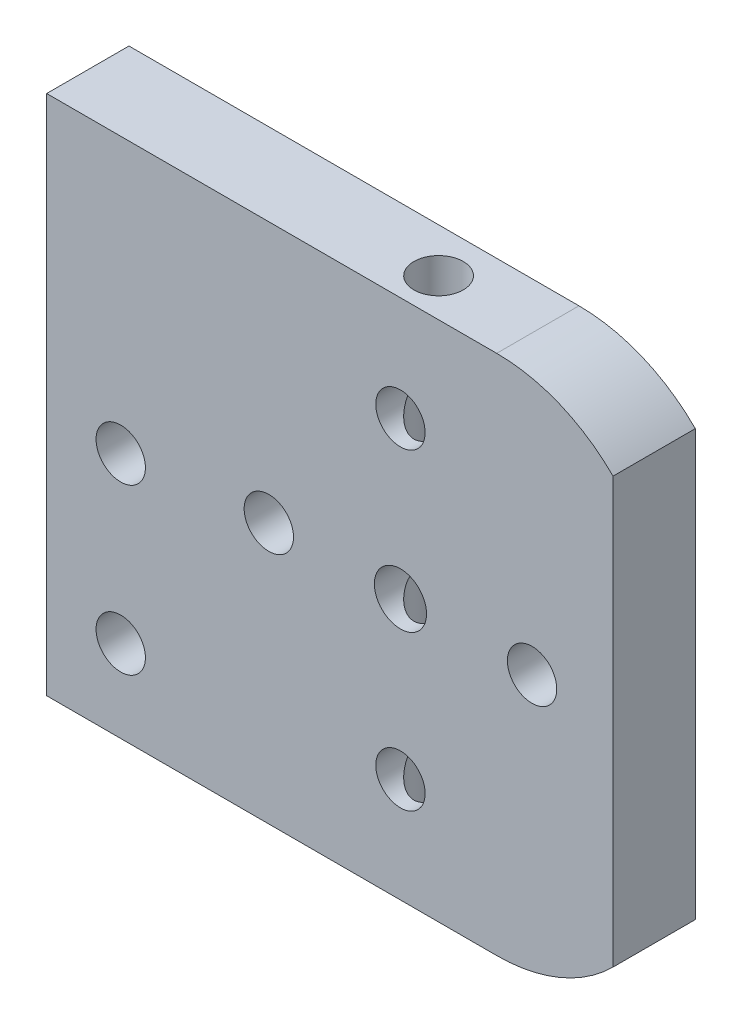
ISO-10303-21;
HEADER;
FILE_DESCRIPTION(('STEP AP214'),'2;1');
FILE_NAME('part.step','',(''),(''),'','','');
FILE_SCHEMA(('AUTOMOTIVE_DESIGN { 1 0 10303 214 1 1 1 1 }'));
ENDSEC;
DATA;
#1=APPLICATION_CONTEXT('core data for automotive mechanical design processes');
#2=APPLICATION_PROTOCOL_DEFINITION('international standard','automotive_design',2000,#1);
#3=PRODUCT_CONTEXT('',#1,'mechanical');
#4=PRODUCT('Part','Part','',(#3));
#5=PRODUCT_RELATED_PRODUCT_CATEGORY('part','',(#4));
#6=PRODUCT_DEFINITION_FORMATION('','',#4);
#7=PRODUCT_DEFINITION_CONTEXT('part definition',#1,'design');
#8=PRODUCT_DEFINITION('design','',#6,#7);
#9=PRODUCT_DEFINITION_SHAPE('','',#8);
#10=(LENGTH_UNIT() NAMED_UNIT(*) SI_UNIT(.MILLI.,.METRE.));
#11=(NAMED_UNIT(*) PLANE_ANGLE_UNIT() SI_UNIT($,.RADIAN.));
#12=(NAMED_UNIT(*) SI_UNIT($,.STERADIAN.) SOLID_ANGLE_UNIT());
#13=UNCERTAINTY_MEASURE_WITH_UNIT(LENGTH_MEASURE(1.E-05),#10,'distance_accuracy_value','');
#14=(GEOMETRIC_REPRESENTATION_CONTEXT(3) GLOBAL_UNCERTAINTY_ASSIGNED_CONTEXT((#13)) GLOBAL_UNIT_ASSIGNED_CONTEXT((#10,
#11,#12)) REPRESENTATION_CONTEXT('',''));
#15=CARTESIAN_POINT('',(0.,0.,0.));
#16=DIRECTION('',(0.,0.,1.));
#17=DIRECTION('',(1.,0.,0.));
#18=AXIS2_PLACEMENT_3D('',#15,#16,#17);
#19=CARTESIAN_POINT('',(7.86719839637505,-1.41337693222356,5.));
#20=DIRECTION('',(0.,0.,-1.));
#21=DIRECTION('',(-1.,0.,0.));
#22=AXIS2_PLACEMENT_3D('',#19,#20,#21);
#23=CYLINDRICAL_SURFACE('',#22,1.49999999999997);
#24=CARTESIAN_POINT('',(7.86719839637503,-1.41337693222356,2.68208482680166));
#25=DIRECTION('',(0.,0.707106781186547,-0.707106781186547));
#26=DIRECTION('',(0.,-0.707106781186547,-0.707106781186547));
#27=AXIS2_PLACEMENT_3D('',#24,#25,#26);
#28=ELLIPSE('',#27,2.12132034355962,1.49999999999999);
#29=CARTESIAN_POINT('',(9.36719839637501,-1.41337693222356,2.68208482680166));
#30=VERTEX_POINT('',#29);
#31=CARTESIAN_POINT('',(6.36719839637504,-1.41337693222356,2.68208482680166));
#32=VERTEX_POINT('',#31);
#33=EDGE_CURVE('E260',#30,#32,#28,.F.);
#34=ORIENTED_EDGE('',*,*,#33,.F.);
#35=CARTESIAN_POINT('',(7.86719839637503,-1.41337693222356,2.68208482680166));
#36=DIRECTION('',(0.,-0.707106781186547,-0.707106781186547));
#37=DIRECTION('',(0.,0.707106781186547,-0.707106781186547));
#38=AXIS2_PLACEMENT_3D('',#35,#36,#37);
#39=ELLIPSE('',#38,2.12132034355962,1.49999999999999);
#40=EDGE_CURVE('E49',#32,#30,#39,.F.);
#41=ORIENTED_EDGE('',*,*,#40,.F.);
#42=EDGE_LOOP('',(#34,#41));
#43=FACE_BOUND('',#42,.T.);
#44=CARTESIAN_POINT('',(7.86719839637505,-1.41337693222356,5.));
#45=DIRECTION('',(0.,0.,1.));
#46=DIRECTION('',(1.,0.,0.));
#47=AXIS2_PLACEMENT_3D('',#44,#45,#46);
#48=CIRCLE('',#47,1.49999999999997);
#49=CARTESIAN_POINT('',(9.36719839637502,-1.41337693222356,5.));
#50=VERTEX_POINT('',#49);
#51=EDGE_CURVE('E170',#50,#50,#48,.T.);
#52=ORIENTED_EDGE('',*,*,#51,.T.);
#53=EDGE_LOOP('',(#52));
#54=FACE_BOUND('',#53,.T.);
#55=ADVANCED_FACE('F35',(#43,#54),#23,.F.);
#56=CARTESIAN_POINT('',(7.86719839637505,17.5866230677764,5.));
#57=DIRECTION('',(0.,0.,-1.));
#58=DIRECTION('',(-1.,0.,0.));
#59=AXIS2_PLACEMENT_3D('',#56,#57,#58);
#60=CYLINDRICAL_SURFACE('',#59,1.5);
#61=CARTESIAN_POINT('',(7.86719839637503,17.5866230677764,2.68208482680166));
#62=DIRECTION('',(0.,0.707106781186547,-0.707106781186547));
#63=DIRECTION('',(0.,-0.707106781186547,-0.707106781186547));
#64=AXIS2_PLACEMENT_3D('',#61,#62,#63);
#65=ELLIPSE('',#64,2.12132034355964,1.5);
#66=CARTESIAN_POINT('',(9.36719839637503,17.5866230677764,2.68208482680166));
#67=VERTEX_POINT('',#66);
#68=CARTESIAN_POINT('',(6.36719839637503,17.5866230677764,2.68208482680166));
#69=VERTEX_POINT('',#68);
#70=EDGE_CURVE('E11',#67,#69,#65,.F.);
#71=ORIENTED_EDGE('',*,*,#70,.F.);
#72=CARTESIAN_POINT('',(7.86719839637503,17.5866230677764,2.68208482680166));
#73=DIRECTION('',(0.,-0.707106781186547,-0.707106781186547));
#74=DIRECTION('',(0.,0.707106781186547,-0.707106781186547));
#75=AXIS2_PLACEMENT_3D('',#72,#73,#74);
#76=ELLIPSE('',#75,2.12132034355964,1.5);
#77=EDGE_CURVE('E56',#69,#67,#76,.F.);
#78=ORIENTED_EDGE('',*,*,#77,.F.);
#79=EDGE_LOOP('',(#71,#78));
#80=FACE_BOUND('',#79,.T.);
#81=CARTESIAN_POINT('',(7.86719839637505,17.5866230677764,5.));
#82=DIRECTION('',(0.,0.,1.));
#83=DIRECTION('',(1.,0.,0.));
#84=AXIS2_PLACEMENT_3D('',#81,#82,#83);
#85=CIRCLE('',#84,1.5);
#86=CARTESIAN_POINT('',(9.36719839637505,17.5866230677764,5.));
#87=VERTEX_POINT('',#86);
#88=EDGE_CURVE('E182',#87,#87,#85,.T.);
#89=ORIENTED_EDGE('',*,*,#88,.T.);
#90=EDGE_LOOP('',(#89));
#91=FACE_BOUND('',#90,.T.);
#92=ADVANCED_FACE('F111',(#80,#91),#60,.F.);
#93=CARTESIAN_POINT('',(13.717198396375,2.23662306777646,5.));
#94=DIRECTION('',(0.,0.,1.));
#95=DIRECTION('',(1.,0.,0.));
#96=AXIS2_PLACEMENT_3D('',#93,#94,#95);
#97=PLANE('',#96);
#98=CARTESIAN_POINT('',(-9.13280160362503,7.23662306777646,5.));
#99=DIRECTION('',(0.,0.,1.));
#100=DIRECTION('',(1.,0.,0.));
#101=AXIS2_PLACEMENT_3D('',#98,#99,#100);
#102=CIRCLE('',#101,1.5);
#103=CARTESIAN_POINT('',(-7.63280160362503,7.23662306777646,5.));
#104=VERTEX_POINT('',#103);
#105=EDGE_CURVE('E188',#104,#104,#102,.T.);
#106=ORIENTED_EDGE('',*,*,#105,.F.);
#107=EDGE_LOOP('',(#106));
#108=FACE_BOUND('',#107,.T.);
#109=CARTESIAN_POINT('',(15.8671983963751,8.08662306777644,5.));
#110=DIRECTION('',(0.,0.,1.));
#111=DIRECTION('',(1.,0.,0.));
#112=AXIS2_PLACEMENT_3D('',#109,#110,#111);
#113=CIRCLE('',#112,1.50000000000002);
#114=CARTESIAN_POINT('',(17.3671983963751,8.08662306777644,5.));
#115=VERTEX_POINT('',#114);
#116=EDGE_CURVE('E176',#115,#115,#113,.T.);
#117=ORIENTED_EDGE('',*,*,#116,.F.);
#118=EDGE_LOOP('',(#117));
#119=FACE_BOUND('',#118,.T.);
#120=CARTESIAN_POINT('',(-0.132801603625013,8.08662306777644,5.));
#121=DIRECTION('',(0.,0.,1.));
#122=DIRECTION('',(1.,0.,0.));
#123=AXIS2_PLACEMENT_3D('',#120,#121,#122);
#124=CIRCLE('',#123,1.50000000000002);
#125=CARTESIAN_POINT('',(1.367198396375,8.08662306777644,5.));
#126=VERTEX_POINT('',#125);
#127=EDGE_CURVE('E164',#126,#126,#124,.T.);
#128=ORIENTED_EDGE('',*,*,#127,.F.);
#129=EDGE_LOOP('',(#128));
#130=FACE_BOUND('',#129,.T.);
#131=CARTESIAN_POINT('',(13.717198396375,2.23662306777646,5.));
#132=DIRECTION('',(0.,0.,1.));
#133=DIRECTION('',(1.,0.,0.));
#134=AXIS2_PLACEMENT_3D('',#131,#132,#133);
#135=CIRCLE('',#134,10.);
#136=CARTESIAN_POINT('',(13.717198396375,-7.76337693222354,5.));
#137=VERTEX_POINT('',#136);
#138=CARTESIAN_POINT('',(20.7882662082405,-4.83444474408904,5.));
#139=VERTEX_POINT('',#138);
#140=EDGE_CURVE('E136',#137,#139,#135,.T.);
#141=ORIENTED_EDGE('',*,*,#140,.T.);
#142=DIRECTION('',(0.,1.,0.));
#143=VECTOR('',#142,1.);
#144=CARTESIAN_POINT('',(20.7882662082405,21.0076908796419,5.));
#145=LINE('',#144,#143);
#146=CARTESIAN_POINT('',(20.7882662082405,21.0076908796419,5.));
#147=VERTEX_POINT('',#146);
#148=EDGE_CURVE('E157',#139,#147,#145,.T.);
#149=ORIENTED_EDGE('',*,*,#148,.T.);
#150=CARTESIAN_POINT('',(13.717198396375,13.9366230677765,5.));
#151=DIRECTION('',(0.,0.,1.));
#152=DIRECTION('',(1.,0.,0.));
#153=AXIS2_PLACEMENT_3D('',#150,#151,#152);
#154=CIRCLE('',#153,10.);
#155=CARTESIAN_POINT('',(13.717198396375,23.9366230677765,5.));
#156=VERTEX_POINT('',#155);
#157=EDGE_CURVE('E155',#147,#156,#154,.T.);
#158=ORIENTED_EDGE('',*,*,#157,.T.);
#159=DIRECTION('',(-1.,0.,0.));
#160=VECTOR('',#159,1.);
#161=CARTESIAN_POINT('',(-13.632801603625,23.9366230677765,5.));
#162=LINE('',#161,#160);
#163=CARTESIAN_POINT('',(-13.632801603625,23.9366230677765,5.));
#164=VERTEX_POINT('',#163);
#165=EDGE_CURVE('E153',#156,#164,#162,.T.);
#166=ORIENTED_EDGE('',*,*,#165,.T.);
#167=DIRECTION('',(0.,-1.,0.));
#168=VECTOR('',#167,1.);
#169=CARTESIAN_POINT('',(-13.632801603625,23.9366230677765,5.));
#170=LINE('',#169,#168);
#171=CARTESIAN_POINT('',(-13.6328016036251,-7.76337693222354,5.));
#172=VERTEX_POINT('',#171);
#173=EDGE_CURVE('E151',#164,#172,#170,.T.);
#174=ORIENTED_EDGE('',*,*,#173,.T.);
#175=DIRECTION('',(1.,0.,0.));
#176=VECTOR('',#175,1.);
#177=CARTESIAN_POINT('',(-13.6328016036251,-7.76337693222354,5.));
#178=LINE('',#177,#176);
#179=EDGE_CURVE('E133',#172,#137,#178,.T.);
#180=ORIENTED_EDGE('',*,*,#179,.T.);
#181=EDGE_LOOP('',(#141,#149,#158,#166,#174,#180));
#182=FACE_BOUND('',#181,.T.);
#183=CARTESIAN_POINT('',(7.86719839637505,8.08662306777644,5.));
#184=DIRECTION('',(0.,0.,1.));
#185=DIRECTION('',(1.,0.,0.));
#186=AXIS2_PLACEMENT_3D('',#183,#184,#185);
#187=CIRCLE('',#186,1.585);
#188=CARTESIAN_POINT('',(9.45219839637505,8.08662306777644,5.));
#189=VERTEX_POINT('',#188);
#190=EDGE_CURVE('E149',#189,#189,#187,.T.);
#191=ORIENTED_EDGE('',*,*,#190,.F.);
#192=EDGE_LOOP('',(#191));
#193=FACE_BOUND('',#192,.T.);
#194=ORIENTED_EDGE('',*,*,#51,.F.);
#195=EDGE_LOOP('',(#194));
#196=FACE_BOUND('',#195,.T.);
#197=ORIENTED_EDGE('',*,*,#88,.F.);
#198=EDGE_LOOP('',(#197));
#199=FACE_BOUND('',#198,.T.);
#200=CARTESIAN_POINT('',(-9.13280160362503,-2.76337693222354,5.));
#201=DIRECTION('',(0.,0.,1.));
#202=DIRECTION('',(1.,0.,0.));
#203=AXIS2_PLACEMENT_3D('',#200,#201,#202);
#204=CIRCLE('',#203,1.5);
#205=CARTESIAN_POINT('',(-7.63280160362503,-2.76337693222354,5.));
#206=VERTEX_POINT('',#205);
#207=EDGE_CURVE('E194',#206,#206,#204,.T.);
#208=ORIENTED_EDGE('',*,*,#207,.F.);
#209=EDGE_LOOP('',(#208));
#210=FACE_BOUND('',#209,.T.);
#211=ADVANCED_FACE('F257',(#108,#119,#130,#182,#193,#196,#199,#210),#97,.T.);
#212=CARTESIAN_POINT('',(13.717198396375,2.23662306777646,0.));
#213=DIRECTION('',(0.,0.,1.));
#214=DIRECTION('',(1.,0.,0.));
#215=AXIS2_PLACEMENT_3D('',#212,#213,#214);
#216=PLANE('',#215);
#217=CARTESIAN_POINT('',(13.717198396375,2.23662306777646,0.));
#218=DIRECTION('',(0.,0.,1.));
#219=DIRECTION('',(1.,0.,0.));
#220=AXIS2_PLACEMENT_3D('',#217,#218,#219);
#221=CIRCLE('',#220,10.);
#222=CARTESIAN_POINT('',(13.717198396375,-7.76337693222354,0.));
#223=VERTEX_POINT('',#222);
#224=CARTESIAN_POINT('',(20.7882662082405,-4.83444474408904,0.));
#225=VERTEX_POINT('',#224);
#226=EDGE_CURVE('E146',#223,#225,#221,.T.);
#227=ORIENTED_EDGE('',*,*,#226,.F.);
#228=DIRECTION('',(1.,0.,0.));
#229=VECTOR('',#228,1.);
#230=CARTESIAN_POINT('',(-13.6328016036251,-7.76337693222354,0.));
#231=LINE('',#230,#229);
#232=CARTESIAN_POINT('',(-13.6328016036251,-7.76337693222354,0.));
#233=VERTEX_POINT('',#232);
#234=EDGE_CURVE('E134',#233,#223,#231,.T.);
#235=ORIENTED_EDGE('',*,*,#234,.F.);
#236=DIRECTION('',(0.,-1.,0.));
#237=VECTOR('',#236,1.);
#238=CARTESIAN_POINT('',(-13.632801603625,2.93662306777645,0.));
#239=LINE('',#238,#237);
#240=CARTESIAN_POINT('',(-13.632801603625,23.9366230677765,0.));
#241=VERTEX_POINT('',#240);
#242=EDGE_CURVE('E137',#241,#233,#239,.T.);
#243=ORIENTED_EDGE('',*,*,#242,.F.);
#244=DIRECTION('',(-1.,0.,0.));
#245=VECTOR('',#244,1.);
#246=CARTESIAN_POINT('',(-13.632801603625,23.9366230677765,0.));
#247=LINE('',#246,#245);
#248=CARTESIAN_POINT('',(13.717198396375,23.9366230677765,0.));
#249=VERTEX_POINT('',#248);
#250=EDGE_CURVE('E139',#249,#241,#247,.T.);
#251=ORIENTED_EDGE('',*,*,#250,.F.);
#252=CARTESIAN_POINT('',(13.717198396375,13.9366230677765,0.));
#253=DIRECTION('',(0.,0.,1.));
#254=DIRECTION('',(1.,0.,0.));
#255=AXIS2_PLACEMENT_3D('',#252,#253,#254);
#256=CIRCLE('',#255,10.);
#257=CARTESIAN_POINT('',(20.7882662082405,21.0076908796419,0.));
#258=VERTEX_POINT('',#257);
#259=EDGE_CURVE('E142',#258,#249,#256,.T.);
#260=ORIENTED_EDGE('',*,*,#259,.F.);
#261=DIRECTION('',(0.,1.,0.));
#262=VECTOR('',#261,1.);
#263=CARTESIAN_POINT('',(20.7882662082405,21.0076908796419,0.));
#264=LINE('',#263,#262);
#265=EDGE_CURVE('E144',#225,#258,#264,.T.);
#266=ORIENTED_EDGE('',*,*,#265,.F.);
#267=EDGE_LOOP('',(#227,#235,#243,#251,#260,#266));
#268=FACE_BOUND('',#267,.T.);
#269=CARTESIAN_POINT('',(7.86719839637505,8.08662306777644,0.));
#270=DIRECTION('',(0.,0.,1.));
#271=DIRECTION('',(1.,0.,0.));
#272=AXIS2_PLACEMENT_3D('',#269,#270,#271);
#273=CIRCLE('',#272,1.585);
#274=CARTESIAN_POINT('',(9.45219839637505,8.08662306777644,0.));
#275=VERTEX_POINT('',#274);
#276=EDGE_CURVE('E161',#275,#275,#273,.T.);
#277=ORIENTED_EDGE('',*,*,#276,.T.);
#278=EDGE_LOOP('',(#277));
#279=FACE_BOUND('',#278,.T.);
#280=CARTESIAN_POINT('',(-0.132801603625013,8.08662306777644,0.));
#281=DIRECTION('',(0.,0.,1.));
#282=DIRECTION('',(1.,0.,0.));
#283=AXIS2_PLACEMENT_3D('',#280,#281,#282);
#284=CIRCLE('',#283,1.50000000000002);
#285=CARTESIAN_POINT('',(1.367198396375,8.08662306777644,0.));
#286=VERTEX_POINT('',#285);
#287=EDGE_CURVE('E167',#286,#286,#284,.T.);
#288=ORIENTED_EDGE('',*,*,#287,.T.);
#289=EDGE_LOOP('',(#288));
#290=FACE_BOUND('',#289,.T.);
#291=CARTESIAN_POINT('',(7.86719839637505,-1.41337693222356,0.));
#292=DIRECTION('',(0.,0.,1.));
#293=DIRECTION('',(1.,0.,0.));
#294=AXIS2_PLACEMENT_3D('',#291,#292,#293);
#295=CIRCLE('',#294,1.49999999999997);
#296=CARTESIAN_POINT('',(9.36719839637502,-1.41337693222356,0.));
#297=VERTEX_POINT('',#296);
#298=EDGE_CURVE('E173',#297,#297,#295,.T.);
#299=ORIENTED_EDGE('',*,*,#298,.T.);
#300=EDGE_LOOP('',(#299));
#301=FACE_BOUND('',#300,.T.);
#302=CARTESIAN_POINT('',(15.8671983963751,8.08662306777644,0.));
#303=DIRECTION('',(0.,0.,1.));
#304=DIRECTION('',(1.,0.,0.));
#305=AXIS2_PLACEMENT_3D('',#302,#303,#304);
#306=CIRCLE('',#305,1.50000000000002);
#307=CARTESIAN_POINT('',(17.3671983963751,8.08662306777644,0.));
#308=VERTEX_POINT('',#307);
#309=EDGE_CURVE('E179',#308,#308,#306,.T.);
#310=ORIENTED_EDGE('',*,*,#309,.T.);
#311=EDGE_LOOP('',(#310));
#312=FACE_BOUND('',#311,.T.);
#313=CARTESIAN_POINT('',(7.86719839637505,17.5866230677764,0.));
#314=DIRECTION('',(0.,0.,1.));
#315=DIRECTION('',(1.,0.,0.));
#316=AXIS2_PLACEMENT_3D('',#313,#314,#315);
#317=CIRCLE('',#316,1.5);
#318=CARTESIAN_POINT('',(9.36719839637505,17.5866230677764,0.));
#319=VERTEX_POINT('',#318);
#320=EDGE_CURVE('E185',#319,#319,#317,.T.);
#321=ORIENTED_EDGE('',*,*,#320,.T.);
#322=EDGE_LOOP('',(#321));
#323=FACE_BOUND('',#322,.T.);
#324=CARTESIAN_POINT('',(-9.13280160362503,7.23662306777646,0.));
#325=DIRECTION('',(0.,0.,1.));
#326=DIRECTION('',(1.,0.,0.));
#327=AXIS2_PLACEMENT_3D('',#324,#325,#326);
#328=CIRCLE('',#327,1.5);
#329=CARTESIAN_POINT('',(-7.63280160362503,7.23662306777646,0.));
#330=VERTEX_POINT('',#329);
#331=EDGE_CURVE('E191',#330,#330,#328,.T.);
#332=ORIENTED_EDGE('',*,*,#331,.T.);
#333=EDGE_LOOP('',(#332));
#334=FACE_BOUND('',#333,.T.);
#335=CARTESIAN_POINT('',(-9.13280160362503,-2.76337693222354,0.));
#336=DIRECTION('',(0.,0.,1.));
#337=DIRECTION('',(1.,0.,0.));
#338=AXIS2_PLACEMENT_3D('',#335,#336,#337);
#339=CIRCLE('',#338,1.5);
#340=CARTESIAN_POINT('',(-7.63280160362503,-2.76337693222354,0.));
#341=VERTEX_POINT('',#340);
#342=EDGE_CURVE('E197',#341,#341,#339,.T.);
#343=ORIENTED_EDGE('',*,*,#342,.T.);
#344=EDGE_LOOP('',(#343));
#345=FACE_BOUND('',#344,.T.);
#346=ADVANCED_FACE('F266',(#268,#279,#290,#301,#312,#323,#334,#345),#216,.F.);
#347=CARTESIAN_POINT('',(13.717198396375,2.23662306777646,5.));
#348=DIRECTION('',(0.,0.,-1.));
#349=DIRECTION('',(-1.,0.,0.));
#350=AXIS2_PLACEMENT_3D('',#347,#348,#349);
#351=CYLINDRICAL_SURFACE('',#350,10.);
#352=ORIENTED_EDGE('',*,*,#226,.T.);
#353=DIRECTION('',(0.,0.,-1.));
#354=VECTOR('',#353,1.);
#355=CARTESIAN_POINT('',(20.7882662082405,-4.83444474408904,5.));
#356=LINE('',#355,#354);
#357=EDGE_CURVE('E109',#139,#225,#356,.T.);
#358=ORIENTED_EDGE('',*,*,#357,.F.);
#359=ORIENTED_EDGE('',*,*,#140,.F.);
#360=DIRECTION('',(0.,0.,-1.));
#361=VECTOR('',#360,1.);
#362=CARTESIAN_POINT('',(13.717198396375,-7.76337693222354,5.));
#363=LINE('',#362,#361);
#364=EDGE_CURVE('E130',#137,#223,#363,.T.);
#365=ORIENTED_EDGE('',*,*,#364,.T.);
#366=EDGE_LOOP('',(#352,#358,#359,#365));
#367=FACE_BOUND('',#366,.T.);
#368=ADVANCED_FACE('F37',(#367),#351,.T.);
#369=CARTESIAN_POINT('',(20.7882662082405,21.0076908796419,5.));
#370=DIRECTION('',(-1.,0.,0.));
#371=DIRECTION('',(0.,-1.,0.));
#372=AXIS2_PLACEMENT_3D('',#369,#370,#371);
#373=PLANE('',#372);
#374=ORIENTED_EDGE('',*,*,#265,.T.);
#375=DIRECTION('',(0.,0.,-1.));
#376=VECTOR('',#375,1.);
#377=CARTESIAN_POINT('',(20.7882662082405,21.0076908796419,5.));
#378=LINE('',#377,#376);
#379=EDGE_CURVE('E118',#147,#258,#378,.T.);
#380=ORIENTED_EDGE('',*,*,#379,.F.);
#381=ORIENTED_EDGE('',*,*,#148,.F.);
#382=ORIENTED_EDGE('',*,*,#357,.T.);
#383=EDGE_LOOP('',(#374,#380,#381,#382));
#384=FACE_BOUND('',#383,.T.);
#385=ADVANCED_FACE('F280',(#384),#373,.F.);
#386=CARTESIAN_POINT('',(13.717198396375,13.9366230677765,5.));
#387=DIRECTION('',(0.,0.,-1.));
#388=DIRECTION('',(-1.,0.,0.));
#389=AXIS2_PLACEMENT_3D('',#386,#387,#388);
#390=CYLINDRICAL_SURFACE('',#389,10.);
#391=ORIENTED_EDGE('',*,*,#259,.T.);
#392=DIRECTION('',(0.,0.,-1.));
#393=VECTOR('',#392,1.);
#394=CARTESIAN_POINT('',(13.717198396375,23.9366230677765,5.));
#395=LINE('',#394,#393);
#396=EDGE_CURVE('E121',#156,#249,#395,.T.);
#397=ORIENTED_EDGE('',*,*,#396,.F.);
#398=ORIENTED_EDGE('',*,*,#157,.F.);
#399=ORIENTED_EDGE('',*,*,#379,.T.);
#400=EDGE_LOOP('',(#391,#397,#398,#399));
#401=FACE_BOUND('',#400,.T.);
#402=ADVANCED_FACE('F295',(#401),#390,.T.);
#403=CARTESIAN_POINT('',(-13.632801603625,23.9366230677765,5.));
#404=DIRECTION('',(0.,-1.,0.));
#405=DIRECTION('',(0.,0.,-1.));
#406=AXIS2_PLACEMENT_3D('',#403,#404,#405);
#407=PLANE('',#406);
#408=CARTESIAN_POINT('',(7.867198396375,23.9366230677765,2.68208482680166));
#409=DIRECTION('',(0.,1.,0.));
#410=DIRECTION('',(0.,0.,1.));
#411=AXIS2_PLACEMENT_3D('',#408,#409,#410);
#412=CIRCLE('',#411,1.5);
#413=CARTESIAN_POINT('',(7.867198396375,23.9366230677765,4.18208482680166));
#414=VERTEX_POINT('',#413);
#415=EDGE_CURVE('E419',#414,#414,#412,.T.);
#416=ORIENTED_EDGE('',*,*,#415,.F.);
#417=EDGE_LOOP('',(#416));
#418=FACE_BOUND('',#417,.T.);
#419=ORIENTED_EDGE('',*,*,#250,.T.);
#420=DIRECTION('',(0.,0.,-1.));
#421=VECTOR('',#420,1.);
#422=CARTESIAN_POINT('',(-13.632801603625,23.9366230677765,5.));
#423=LINE('',#422,#421);
#424=EDGE_CURVE('E124',#164,#241,#423,.T.);
#425=ORIENTED_EDGE('',*,*,#424,.F.);
#426=ORIENTED_EDGE('',*,*,#165,.F.);
#427=ORIENTED_EDGE('',*,*,#396,.T.);
#428=EDGE_LOOP('',(#419,#425,#426,#427));
#429=FACE_BOUND('',#428,.T.);
#430=ADVANCED_FACE('F291',(#418,#429),#407,.F.);
#431=CARTESIAN_POINT('',(-13.632801603625,2.93662306777645,5.));
#432=DIRECTION('',(1.,0.,0.));
#433=DIRECTION('',(0.,1.,0.));
#434=AXIS2_PLACEMENT_3D('',#431,#432,#433);
#435=PLANE('',#434);
#436=ORIENTED_EDGE('',*,*,#242,.T.);
#437=DIRECTION('',(0.,0.,-1.));
#438=VECTOR('',#437,1.);
#439=CARTESIAN_POINT('',(-13.6328016036251,-7.76337693222354,5.));
#440=LINE('',#439,#438);
#441=EDGE_CURVE('E127',#172,#233,#440,.T.);
#442=ORIENTED_EDGE('',*,*,#441,.F.);
#443=ORIENTED_EDGE('',*,*,#173,.F.);
#444=ORIENTED_EDGE('',*,*,#424,.T.);
#445=EDGE_LOOP('',(#436,#442,#443,#444));
#446=FACE_BOUND('',#445,.T.);
#447=ADVANCED_FACE('F287',(#446),#435,.F.);
#448=CARTESIAN_POINT('',(-13.6328016036251,-7.76337693222354,5.));
#449=DIRECTION('',(0.,1.,0.));
#450=DIRECTION('',(0.,0.,1.));
#451=AXIS2_PLACEMENT_3D('',#448,#449,#450);
#452=PLANE('',#451);
#453=CARTESIAN_POINT('',(7.867198396375,-7.76337693222354,2.68208482680166));
#454=DIRECTION('',(0.,1.,0.));
#455=DIRECTION('',(0.,0.,1.));
#456=AXIS2_PLACEMENT_3D('',#453,#454,#455);
#457=CIRCLE('',#456,1.5);
#458=CARTESIAN_POINT('',(7.867198396375,-7.76337693222354,4.18208482680166));
#459=VERTEX_POINT('',#458);
#460=EDGE_CURVE('E200',#459,#459,#457,.T.);
#461=ORIENTED_EDGE('',*,*,#460,.T.);
#462=EDGE_LOOP('',(#461));
#463=FACE_BOUND('',#462,.T.);
#464=ORIENTED_EDGE('',*,*,#234,.T.);
#465=ORIENTED_EDGE('',*,*,#364,.F.);
#466=ORIENTED_EDGE('',*,*,#179,.F.);
#467=ORIENTED_EDGE('',*,*,#441,.T.);
#468=EDGE_LOOP('',(#464,#465,#466,#467));
#469=FACE_BOUND('',#468,.T.);
#470=ADVANCED_FACE('F250',(#463,#469),#452,.F.);
#471=CARTESIAN_POINT('',(7.86719839637505,8.08662306777644,5.));
#472=DIRECTION('',(0.,0.,-1.));
#473=DIRECTION('',(-1.,0.,0.));
#474=AXIS2_PLACEMENT_3D('',#471,#472,#473);
#475=CYLINDRICAL_SURFACE('',#474,1.585);
#476=CARTESIAN_POINT('',(7.867198396375,6.50162306777644,4.18208482680166));
#477=CARTESIAN_POINT('',(7.93552465766112,6.50162565469981,4.18208222284637));
#478=CARTESIAN_POINT('',(8.0038692746652,6.50607813050905,4.17737963703772));
#479=CARTESIAN_POINT('',(8.13822179532348,6.52349413607178,4.15895848310122));
#480=CARTESIAN_POINT('',(8.20422784854183,6.53646425376394,4.14523293618899));
#481=CARTESIAN_POINT('',(8.3316048892296,6.56976369797077,4.10990550687053));
#482=CARTESIAN_POINT('',(8.39300261251419,6.5900458405079,4.08835411775751));
#483=CARTESIAN_POINT('',(8.51052654410176,6.63667191055165,4.03862742238309));
#484=CARTESIAN_POINT('',(8.56665139357095,6.66301739459642,4.01045041519948));
#485=CARTESIAN_POINT('',(8.69480826064005,6.73217482873168,3.93610303556975));
#486=CARTESIAN_POINT('',(8.76403067218221,6.7773267313128,3.88727466897951));
#487=CARTESIAN_POINT('',(8.89103135354862,6.87402622851047,3.78146549837028));
#488=CARTESIAN_POINT('',(8.94877208942657,6.92559393168764,3.72445897213319));
#489=CARTESIAN_POINT('',(9.03471922742202,7.01356152225882,3.62524863011493));
#490=CARTESIAN_POINT('',(9.06617639778324,7.04892817105326,3.58487705865065));
#491=CARTESIAN_POINT('',(9.12456524144234,7.12050410257842,3.50160789715438));
#492=CARTESIAN_POINT('',(9.15149358899406,7.1567139825141,3.45870848174499));
#493=CARTESIAN_POINT('',(9.2008516554553,7.22900707225309,3.37050243768073));
#494=CARTESIAN_POINT('',(9.22329156597275,7.26509038196374,3.32520156494189));
#495=CARTESIAN_POINT('',(9.26377528829704,7.33598923473389,3.23178304461343));
#496=CARTESIAN_POINT('',(9.28182457811123,7.37080631099034,3.18366900089197));
#497=CARTESIAN_POINT('',(9.30829296872263,7.42625128043704,3.09982047789698));
#498=CARTESIAN_POINT('',(9.31793951774951,7.44782969167188,3.0651074437724));
#499=CARTESIAN_POINT('',(9.33498855998258,7.48805023081824,2.99345052880046));
#500=CARTESIAN_POINT('',(9.34239270094934,7.5066945099181,2.956508310053));
#501=CARTESIAN_POINT('',(9.353196492112,7.53506881221712,2.88872299216898));
#502=CARTESIAN_POINT('',(9.35712516723984,7.54586264195111,2.8584254042482));
#503=CARTESIAN_POINT('',(9.36315679841073,7.56277571595112,2.79641549771338));
#504=CARTESIAN_POINT('',(9.36526621338332,7.5689114883715,2.76470860782863));
#505=CARTESIAN_POINT('',(9.36743769607033,7.5752309034958,2.70023035468147));
#506=CARTESIAN_POINT('',(9.36747660332866,7.57534721279696,2.66745105246237));
#507=CARTESIAN_POINT('',(9.36544038171543,7.56941623240951,2.60250246582366));
#508=CARTESIAN_POINT('',(9.36336082176963,7.56335602364588,2.57033460396675));
#509=CARTESIAN_POINT('',(9.35637421312637,7.54374721838377,2.49741982980719));
#510=CARTESIAN_POINT('',(9.35077217831998,7.52841534194407,2.45724699452473));
#511=CARTESIAN_POINT('',(9.33690991855465,7.49287336319993,2.37956509239337));
#512=CARTESIAN_POINT('',(9.32863760743643,7.47264118723531,2.34206910220249));
#513=CARTESIAN_POINT('',(9.30859017678358,7.42683850513951,2.26474079107356));
#514=CARTESIAN_POINT('',(9.29650662449771,7.40091686765745,2.22520150294391));
#515=CARTESIAN_POINT('',(9.26957788546357,7.34739253692665,2.14823879034603));
#516=CARTESIAN_POINT('',(9.25472974755646,7.31978806865781,2.11081768320019));
#517=CARTESIAN_POINT('',(9.20609828642564,7.23589864523739,2.00107535902915));
#518=CARTESIAN_POINT('',(9.16824045565445,7.17856857280235,1.93132165972244));
#519=CARTESIAN_POINT('',(9.07465304625787,7.05651327240252,1.78737105698295));
#520=CARTESIAN_POINT('',(9.01705729736022,6.99202869542946,1.71417707134788));
#521=CARTESIAN_POINT('',(8.88617977138704,6.86928491293897,1.57728129338423));
#522=CARTESIAN_POINT('',(8.8129424265978,6.81100876001503,1.51355346279756));
#523=CARTESIAN_POINT('',(8.67702653238435,6.72256439927949,1.41770989266465));
#524=CARTESIAN_POINT('',(8.61875219620196,6.68944322029028,1.38207831342082));
#525=CARTESIAN_POINT('',(8.49519412536729,6.62972808952892,1.31810126775883));
#526=CARTESIAN_POINT('',(8.42991368105424,6.60313109286465,1.28975240214222));
#527=CARTESIAN_POINT('',(8.29265845693874,6.55807090718854,1.24183717812308));
#528=CARTESIAN_POINT('',(8.22062239808444,6.5396931083509,1.22236298193003));
#529=CARTESIAN_POINT('',(8.07264575468916,6.51320643296021,1.19432251308061));
#530=CARTESIAN_POINT('',(7.99671037278876,6.5050842253367,1.18574207972521));
#531=CARTESIAN_POINT('',(7.85548988730086,6.50033180758443,1.1807204840042));
#532=CARTESIAN_POINT('',(7.79030667698019,6.50216738586232,1.18265871409286));
#533=CARTESIAN_POINT('',(7.66144290142332,6.51370475339725,1.19485552711149));
#534=CARTESIAN_POINT('',(7.59776234255134,6.52340657596427,1.20511414527452));
#535=CARTESIAN_POINT('',(7.47632683100465,6.54937177966938,1.23262414979068));
#536=CARTESIAN_POINT('',(7.41843514902231,6.5653399836815,1.24956110548862));
#537=CARTESIAN_POINT('',(7.30672005979456,6.60285516588758,1.28946582104504));
#538=CARTESIAN_POINT('',(7.25289774975421,6.62440364178201,1.31243519998129));
#539=CARTESIAN_POINT('',(7.12748423343629,6.68245988095668,1.37455917108571));
#540=CARTESIAN_POINT('',(7.05834746722646,6.72139750428502,1.41640803088409));
#541=CARTESIAN_POINT('',(6.93014894704968,6.80595897945404,1.5081239426033));
#542=CARTESIAN_POINT('',(6.87111579683448,6.85160115575244,1.55801300700237));
#543=CARTESIAN_POINT('',(6.74442382286057,6.96369197705432,1.68221461469766));
#544=CARTESIAN_POINT('',(6.68076238368115,7.03190392211798,1.7590316882055));
#545=CARTESIAN_POINT('',(6.59810466446862,7.13604446799634,1.88095745000098));
#546=CARTESIAN_POINT('',(6.57268944305456,7.17106501125052,1.92272015126154));
#547=CARTESIAN_POINT('',(6.5259958969248,7.24095281762597,2.00861136243326));
#548=CARTESIAN_POINT('',(6.50471495699015,7.27582016392018,2.05273835407796));
#549=CARTESIAN_POINT('',(6.46879452833388,7.33972657778401,2.1377434559491));
#550=CARTESIAN_POINT('',(6.45364972738627,7.36892926740841,2.17828608494324));
#551=CARTESIAN_POINT('',(6.42654303641525,7.42503467736289,2.26202245309884));
#552=CARTESIAN_POINT('',(6.41458102125898,7.45193748808566,2.30521608795245));
#553=CARTESIAN_POINT('',(6.39683395783371,7.49447416012839,2.38343733694903));
#554=CARTESIAN_POINT('',(6.39025154168503,7.51121865211839,2.41766473229312));
#555=CARTESIAN_POINT('',(6.37933487343975,7.54006517663334,2.48835703614245));
#556=CARTESIAN_POINT('',(6.37499288926195,7.55218313785638,2.52481375687376));
#557=CARTESIAN_POINT('',(6.36976194072223,7.56704944154094,2.5900886802688));
#558=CARTESIAN_POINT('',(6.36827415251541,7.57140071750937,2.61847841477685));
#559=CARTESIAN_POINT('',(6.36694129308813,7.57529232946959,2.67561090087669));
#560=CARTESIAN_POINT('',(6.36709411765397,7.57483882797261,2.7043531530606));
#561=CARTESIAN_POINT('',(6.36901595473202,7.5692441728471,2.76119072660219));
#562=CARTESIAN_POINT('',(6.37077928458065,7.56411950155571,2.78928796677028));
#563=CARTESIAN_POINT('',(6.37574938442937,7.55009685360847,2.84440735326669));
#564=CARTESIAN_POINT('',(6.37895934827521,7.54119053043748,2.87142697600099));
#565=CARTESIAN_POINT('',(6.39043638392812,7.51055152140141,2.95043410812536));
#566=CARTESIAN_POINT('',(6.4005598678623,7.48486475057192,3.00056956574669));
#567=CARTESIAN_POINT('',(6.42488006075686,7.42867103931084,3.09706450268897));
#568=CARTESIAN_POINT('',(6.43909803212156,7.39813932090632,3.14340260589089));
#569=CARTESIAN_POINT('',(6.47243372418766,7.33276867815947,3.23636685056474));
#570=CARTESIAN_POINT('',(6.49182384492295,7.29777786811068,3.282788038876));
#571=CARTESIAN_POINT('',(6.53488020449749,7.2270447722387,3.37304720877533));
#572=CARTESIAN_POINT('',(6.55855026809194,7.19130183973597,3.41688283293453));
#573=CARTESIAN_POINT('',(6.61019221642166,7.12013926494034,3.50209162639523));
#574=CARTESIAN_POINT('',(6.63815727805815,7.08471920265932,3.54346855948814));
#575=CARTESIAN_POINT('',(6.69853842098591,7.01489980446701,3.6237622319142));
#576=CARTESIAN_POINT('',(6.73095469212689,6.980500512169,3.66267886620903));
#577=CARTESIAN_POINT('',(6.8173309469616,6.89701642883724,3.75613008744125));
#578=CARTESIAN_POINT('',(6.87409252114446,6.84894211533035,3.80903621552126));
#579=CARTESIAN_POINT('',(6.99810094014691,6.75893878314817,3.9071961118392));
#580=CARTESIAN_POINT('',(7.06532947452823,6.71699927641323,3.95246296104298));
#581=CARTESIAN_POINT('',(7.19436117391194,6.65010150080784,4.02428444388802));
#582=CARTESIAN_POINT('',(7.25419324126634,6.62343232321791,4.05276871573139));
#583=CARTESIAN_POINT('',(7.37944383359937,6.57706624811017,4.10215855592727));
#584=CARTESIAN_POINT('',(7.44485564592285,6.55736111541473,4.12307307643329));
#585=CARTESIAN_POINT('',(7.5694315240952,6.52874158024802,4.1534075888681));
#586=CARTESIAN_POINT('',(7.62801018583971,6.5186340090138,4.16410036308812));
#587=CARTESIAN_POINT('',(7.74678750529732,6.50507430533301,4.17843939631754));
#588=CARTESIAN_POINT('',(7.80698582328344,6.50162078804812,4.18208712153936));
#589=CARTESIAN_POINT('',(7.867198396375,6.50162306777644,4.18208482680166));
#590=B_SPLINE_CURVE_WITH_KNOTS('',3,(#476,#477,#478,#479,#480,#481,#482,#483,#484,#485,#486,
#487,#488,#489,#490,#491,#492,#493,#494,#495,#496,#497,#498,#499,#500,#501,#502,#503,#504,#505,
#506,#507,#508,#509,#510,#511,#512,#513,#514,#515,#516,#517,#518,#519,#520,#521,#522,#523,#524,
#525,#526,#527,#528,#529,#530,#531,#532,#533,#534,#535,#536,#537,#538,#539,#540,#541,#542,#543,
#544,#545,#546,#547,#548,#549,#550,#551,#552,#553,#554,#555,#556,#557,#558,#559,#560,#561,#562,
#563,#564,#565,#566,#567,#568,#569,#570,#571,#572,#573,#574,#575,#576,#577,#578,#579,#580,#581,
#582,#583,#584,#585,#586,#587,#588,#589),.UNSPECIFIED.,.T.,.F.,(4,2,2,2,2,2,2,2,2,2,2,2,2,2,2,2,
2,2,2,2,2,2,2,2,2,2,2,2,2,2,2,2,2,2,2,2,2,2,2,2,2,2,2,2,2,2,2,2,2,2,2,2,2,2,2,2,4),(0.,
0.204718792052913,0.409596109880053,0.61317436249707,0.816804934692821,1.10322279854721,
1.39056211091133,1.57699139536647,1.76355699218461,1.94969403343285,2.13559763366777,
2.26145084839227,2.38721135833637,2.48411558576109,2.58067434037511,2.67831296544888,
2.7761562357039,2.90551502190262,3.03546771830419,3.18164970770275,3.32798864854796,
3.62083678519674,3.95934439502193,4.29690291786161,4.52384738512725,4.75068573306883,
4.97982889454382,5.20867388900441,5.40336483532666,5.59805660608112,5.78450595751021,
5.9710054024159,6.23862814749321,6.50699644200564,6.86750594116127,7.04779337307105,
7.22796638669463,7.38445410707354,7.54093567414764,7.65669380859414,7.77204972568098,
7.85793004736413,7.94370023401665,8.02916894510427,8.11482728355626,8.28555178865892,
8.45717935496031,8.64076699167164,8.82451950901423,9.00798307742397,9.19145447321931,
9.46431415007116,9.73670175315771,9.95018030413535,10.1634055593601,10.3438517190673,
10.5242603203529),.UNSPECIFIED.);
#591=CARTESIAN_POINT('',(7.867198396375,6.50162306777644,4.18208482680166));
#592=VERTEX_POINT('',#591);
#593=EDGE_CURVE('E205',#592,#592,#590,.T.);
#594=ORIENTED_EDGE('',*,*,#593,.F.);
#595=EDGE_LOOP('',(#594));
#596=FACE_BOUND('',#595,.T.);
#597=CARTESIAN_POINT('',(7.867198396375,9.67162306777644,4.18208482680166));
#598=CARTESIAN_POINT('',(7.79887213508889,9.67162048085306,4.18208222284637));
#599=CARTESIAN_POINT('',(7.7305275180848,9.66716800504381,4.17737963703772));
#600=CARTESIAN_POINT('',(7.59617499742652,9.64975199948108,4.15895848310122));
#601=CARTESIAN_POINT('',(7.53016894420817,9.63678188178891,4.14523293618899));
#602=CARTESIAN_POINT('',(7.40279190352041,9.60348243758208,4.10990550687053));
#603=CARTESIAN_POINT('',(7.34139418023581,9.58320029504494,4.08835411775751));
#604=CARTESIAN_POINT('',(7.22387024864825,9.53657422500119,4.03862742238309));
#605=CARTESIAN_POINT('',(7.16774539917906,9.51022874095641,4.01045041519948));
#606=CARTESIAN_POINT('',(7.03958853210996,9.44107130682114,3.93610303556975));
#607=CARTESIAN_POINT('',(6.9703661205678,9.39591940424001,3.88727466897951));
#608=CARTESIAN_POINT('',(6.84336543920138,9.29921990704233,3.78146549837028));
#609=CARTESIAN_POINT('',(6.78562470332344,9.24765220386515,3.72445897213318));
#610=CARTESIAN_POINT('',(6.69967756532799,9.15968461329396,3.62524863011492));
#611=CARTESIAN_POINT('',(6.66822039496677,9.1243179644995,3.58487705865064));
#612=CARTESIAN_POINT('',(6.60983155130767,9.05274203297433,3.50160789715436));
#613=CARTESIAN_POINT('',(6.58290320375594,9.01653215303864,3.45870848174497));
#614=CARTESIAN_POINT('',(6.5335451372947,8.94423906329963,3.37050243768071));
#615=CARTESIAN_POINT('',(6.51110522677725,8.90815575358897,3.32520156494187));
#616=CARTESIAN_POINT('',(6.47062150445296,8.8372569008188,3.2317830446134));
#617=CARTESIAN_POINT('',(6.45257221463877,8.80243982456234,3.18366900089194));
#618=CARTESIAN_POINT('',(6.42610382402737,8.74699485511562,3.09982047789696));
#619=CARTESIAN_POINT('',(6.4164572750005,8.72541644388077,3.06510744377238));
#620=CARTESIAN_POINT('',(6.39940823276743,8.68519590473441,2.99345052880045));
#621=CARTESIAN_POINT('',(6.39200409180067,8.66655162563454,2.95650831005299));
#622=CARTESIAN_POINT('',(6.38120030063801,8.63817732333552,2.88872299216899));
#623=CARTESIAN_POINT('',(6.37727162551018,8.62738349360152,2.85842540424822));
#624=CARTESIAN_POINT('',(6.37123999433928,8.61047041960151,2.79641549771343));
#625=CARTESIAN_POINT('',(6.36913057936669,8.60433464718113,2.76470860782869));
#626=CARTESIAN_POINT('',(6.36695909667968,8.59801523205682,2.70023035468155));
#627=CARTESIAN_POINT('',(6.36692018942135,8.59789892275565,2.66745105246246));
#628=CARTESIAN_POINT('',(6.36895641103458,8.60382990314309,2.60250246582377));
#629=CARTESIAN_POINT('',(6.37103597098037,8.60989011190671,2.57033460396687));
#630=CARTESIAN_POINT('',(6.37802257962363,8.6294989171688,2.49741982980734));
#631=CARTESIAN_POINT('',(6.38362461443,8.64483079360849,2.45724699452492));
#632=CARTESIAN_POINT('',(6.39748687419531,8.68037277235261,2.3795650923936));
#633=CARTESIAN_POINT('',(6.40575918531352,8.70060494831721,2.34206910220274));
#634=CARTESIAN_POINT('',(6.42580661596634,8.74640763041298,2.26474079107386));
#635=CARTESIAN_POINT('',(6.4378901682522,8.77232926789502,2.22520150294423));
#636=CARTESIAN_POINT('',(6.46481890728629,8.82585359862579,2.1482387903464));
#637=CARTESIAN_POINT('',(6.47966704519338,8.85345806689461,2.11081768320059));
#638=CARTESIAN_POINT('',(6.52829850632414,8.93734749031498,2.00107535902961));
#639=CARTESIAN_POINT('',(6.56615633709527,8.99467756274999,1.93132165972294));
#640=CARTESIAN_POINT('',(6.65974374649175,9.11673286314979,1.78737105698349));
#641=CARTESIAN_POINT('',(6.71733949538933,9.18121744012285,1.71417707134842));
#642=CARTESIAN_POINT('',(6.8482170213624,9.30396122261336,1.57728129338475));
#643=CARTESIAN_POINT('',(6.92145436615158,9.36223737553731,1.51355346279807));
#644=CARTESIAN_POINT('',(7.05737026036496,9.45068173627291,1.41770989266509));
#645=CARTESIAN_POINT('',(7.11564459654735,9.48380291526217,1.38207831342123));
#646=CARTESIAN_POINT('',(7.23920266738202,9.54351804602361,1.31810126775915));
#647=CARTESIAN_POINT('',(7.30448311169507,9.57011504268793,1.2897524021425));
#648=CARTESIAN_POINT('',(7.44173833581059,9.61517522836412,1.24183717812328));
#649=CARTESIAN_POINT('',(7.51377439466491,9.63355302720181,1.22236298193018));
#650=CARTESIAN_POINT('',(7.66175103806023,9.66003970259258,1.19432251308069));
#651=CARTESIAN_POINT('',(7.73768641996067,9.66816191021613,1.18574207972526));
#652=CARTESIAN_POINT('',(7.87890690544861,9.67291432796845,1.1807204840042));
#653=CARTESIAN_POINT('',(7.94409011576929,9.67107874969058,1.18265871409283));
#654=CARTESIAN_POINT('',(8.0729538913262,9.6595413821557,1.19485552711142));
#655=CARTESIAN_POINT('',(8.1366344501982,9.6498395595887,1.20511414527443));
#656=CARTESIAN_POINT('',(8.25806996174492,9.62387435588363,1.23262414979056));
#657=CARTESIAN_POINT('',(8.31596164372727,9.60790615187153,1.24956110548848));
#658=CARTESIAN_POINT('',(8.42767673295503,9.57039096966549,1.28946582104487));
#659=CARTESIAN_POINT('',(8.48149904299539,9.54884249377108,1.3124351999811));
#660=CARTESIAN_POINT('',(8.60691255931331,9.49078625459646,1.37455917108548));
#661=CARTESIAN_POINT('',(8.67604932552314,9.45184863126815,1.41640803088383));
#662=CARTESIAN_POINT('',(8.80424784569992,9.36728715609921,1.50812394260297));
#663=CARTESIAN_POINT('',(8.86328099591512,9.32164497980084,1.55801300700201));
#664=CARTESIAN_POINT('',(8.98997296988906,9.20955415849903,1.68221461469723));
#665=CARTESIAN_POINT('',(9.05363440906849,9.14134221343541,1.75903168820504));
#666=CARTESIAN_POINT('',(9.13629212828105,9.03720166755711,1.88095745000045));
#667=CARTESIAN_POINT('',(9.16170734969513,9.00218112430294,1.92272015126099));
#668=CARTESIAN_POINT('',(9.20840089582491,8.93229331792753,2.00861136243267));
#669=CARTESIAN_POINT('',(9.22968183575957,8.89742597163332,2.05273835407734));
#670=CARTESIAN_POINT('',(9.26560226441589,8.83351955776948,2.13774345594849));
#671=CARTESIAN_POINT('',(9.28074706536353,8.80431686814506,2.17828608494265));
#672=CARTESIAN_POINT('',(9.3078537563346,8.74821145819053,2.2620224530983));
#673=CARTESIAN_POINT('',(9.3198157714909,8.72130864746772,2.30521608795194));
#674=CARTESIAN_POINT('',(9.33756283491621,8.67877197542493,2.38343733694858));
#675=CARTESIAN_POINT('',(9.34414525106491,8.6620274834349,2.41766473229271));
#676=CARTESIAN_POINT('',(9.35506191931022,8.6331809589199,2.48835703614212));
#677=CARTESIAN_POINT('',(9.35940390348803,8.62106299769683,2.52481375687347));
#678=CARTESIAN_POINT('',(9.36463485202776,8.60619669401224,2.59008868026858));
#679=CARTESIAN_POINT('',(9.3661226402346,8.60184541804379,2.61847841477664));
#680=CARTESIAN_POINT('',(9.36745549966188,8.59795380608356,2.67561090087651));
#681=CARTESIAN_POINT('',(9.36730267509604,8.59840730758052,2.70435315306044));
#682=CARTESIAN_POINT('',(9.36538083801799,8.60400196270602,2.76119072660207));
#683=CARTESIAN_POINT('',(9.36361750816937,8.60912663399741,2.78928796677017));
#684=CARTESIAN_POINT('',(9.35864740832065,8.62314928194464,2.84440735326662));
#685=CARTESIAN_POINT('',(9.3554374444748,8.63205560511562,2.87142697600094));
#686=CARTESIAN_POINT('',(9.3439604088219,8.66269461415168,2.95043410812532));
#687=CARTESIAN_POINT('',(9.33383692488771,8.68838138498115,3.00056956574665));
#688=CARTESIAN_POINT('',(9.30951673199316,8.74457509624221,3.09706450268893));
#689=CARTESIAN_POINT('',(9.29529876062846,8.77510681464672,3.14340260589084));
#690=CARTESIAN_POINT('',(9.26196306856237,8.84047745739353,3.23636685056469));
#691=CARTESIAN_POINT('',(9.24257294782709,8.87546826744231,3.28278803887594));
#692=CARTESIAN_POINT('',(9.19951658825256,8.94620136331426,3.37304720877526));
#693=CARTESIAN_POINT('',(9.17584652465811,8.98194429581697,3.41688283293445));
#694=CARTESIAN_POINT('',(9.12420457632841,9.05310687061258,3.50209162639515));
#695=CARTESIAN_POINT('',(9.09623951469192,9.08852693289359,3.54346855948805));
#696=CARTESIAN_POINT('',(9.03585837176419,9.15834633108588,3.62376223191409));
#697=CARTESIAN_POINT('',(9.00344210062321,9.19274562338388,3.66267886620892));
#698=CARTESIAN_POINT('',(8.91706584578852,9.27622970671562,3.75613008744115));
#699=CARTESIAN_POINT('',(8.86030427160565,9.32430402022252,3.80903621552117));
#700=CARTESIAN_POINT('',(8.7362958526032,9.41430735240471,3.90719611183913));
#701=CARTESIAN_POINT('',(8.66906731822188,9.45624685913964,3.95246296104292));
#702=CARTESIAN_POINT('',(8.54003561883816,9.52314463474504,4.02428444388797));
#703=CARTESIAN_POINT('',(8.48020355148376,9.54981381233497,4.05276871573135));
#704=CARTESIAN_POINT('',(8.35495295915074,9.5961798874427,4.10215855592724));
#705=CARTESIAN_POINT('',(8.28954114682725,9.61588502013814,4.12307307643326));
#706=CARTESIAN_POINT('',(8.16496526865489,9.64450455530486,4.15340758886809));
#707=CARTESIAN_POINT('',(8.10638660691037,9.65461212653909,4.16410036308811));
#708=CARTESIAN_POINT('',(7.98760928745273,9.66817183021987,4.17843939631754));
#709=CARTESIAN_POINT('',(7.92741096946659,9.67162534750477,4.18208712153936));
#710=CARTESIAN_POINT('',(7.867198396375,9.67162306777644,4.18208482680166));
#711=B_SPLINE_CURVE_WITH_KNOTS('',3,(#597,#598,#599,#600,#601,#602,#603,#604,#605,#606,#607,
#608,#609,#610,#611,#612,#613,#614,#615,#616,#617,#618,#619,#620,#621,#622,#623,#624,#625,#626,
#627,#628,#629,#630,#631,#632,#633,#634,#635,#636,#637,#638,#639,#640,#641,#642,#643,#644,#645,
#646,#647,#648,#649,#650,#651,#652,#653,#654,#655,#656,#657,#658,#659,#660,#661,#662,#663,#664,
#665,#666,#667,#668,#669,#670,#671,#672,#673,#674,#675,#676,#677,#678,#679,#680,#681,#682,#683,
#684,#685,#686,#687,#688,#689,#690,#691,#692,#693,#694,#695,#696,#697,#698,#699,#700,#701,#702,
#703,#704,#705,#706,#707,#708,#709,#710),.UNSPECIFIED.,.T.,.F.,(4,2,2,2,2,2,2,2,2,2,2,2,2,2,2,2,
2,2,2,2,2,2,2,2,2,2,2,2,2,2,2,2,2,2,2,2,2,2,2,2,2,2,2,2,2,2,2,2,2,2,2,2,2,2,2,2,4),(0.,
0.204718792052917,0.409596109880059,0.61317436249708,0.816804934692832,1.10322279854724,
1.39056211091137,1.57699139536653,1.76355699218469,1.94969403343296,2.13559763366791,
2.26145084839239,2.38721135833648,2.48411558576117,2.58067434037516,2.67831296544889,
2.77615623570388,2.90551502190252,3.035467718304,3.18164970770246,3.32798864854757,
3.62083678519615,3.95934439502126,4.29690291786088,4.52384738512662,4.75068573306829,
4.97982889454339,5.2086738890041,5.40336483532639,5.59805660608089,5.78450595750997,
5.97100540241564,6.23862814749286,6.5069964420052,6.86750594116071,7.04779337307043,
7.22796638669396,7.384454107073,7.54093567414722,7.65669380859386,7.77204972568085,
7.85793004736406,7.94370023401663,8.0291689451043,8.11482728355634,8.28555178865897,
8.45717935496034,8.64076699167162,8.82451950901416,9.00798307742386,9.19145447321915,
9.46431415007103,9.73670175315761,9.95018030413525,10.16340555936,10.3438517190672,
10.5242603203529),.UNSPECIFIED.);
#712=CARTESIAN_POINT('',(7.867198396375,9.67162306777644,4.18208482680166));
#713=VERTEX_POINT('',#712);
#714=EDGE_CURVE('E213',#713,#713,#711,.T.);
#715=ORIENTED_EDGE('',*,*,#714,.F.);
#716=EDGE_LOOP('',(#715));
#717=FACE_BOUND('',#716,.T.);
#718=ORIENTED_EDGE('',*,*,#190,.T.);
#719=EDGE_LOOP('',(#718));
#720=FACE_BOUND('',#719,.T.);
#721=ORIENTED_EDGE('',*,*,#276,.F.);
#722=EDGE_LOOP('',(#721));
#723=FACE_BOUND('',#722,.T.);
#724=ADVANCED_FACE('F218',(#596,#717,#720,#723),#475,.F.);
#725=CARTESIAN_POINT('',(-0.132801603625013,8.08662306777644,5.));
#726=DIRECTION('',(0.,0.,-1.));
#727=DIRECTION('',(-1.,0.,0.));
#728=AXIS2_PLACEMENT_3D('',#725,#726,#727);
#729=CYLINDRICAL_SURFACE('',#728,1.50000000000002);
#730=ORIENTED_EDGE('',*,*,#127,.T.);
#731=EDGE_LOOP('',(#730));
#732=FACE_BOUND('',#731,.T.);
#733=ORIENTED_EDGE('',*,*,#287,.F.);
#734=EDGE_LOOP('',(#733));
#735=FACE_BOUND('',#734,.T.);
#736=ADVANCED_FACE('F243',(#732,#735),#729,.F.);
#737=CARTESIAN_POINT('',(7.86719839637503,-1.41337693222356,2.68208482680166));
#738=DIRECTION('',(0.,0.707106781186547,-0.707106781186547));
#739=DIRECTION('',(0.,-0.707106781186547,-0.707106781186547));
#740=AXIS2_PLACEMENT_3D('',#737,#738,#739);
#741=ELLIPSE('',#740,2.12132034355962,1.49999999999999);
#742=EDGE_CURVE('E416',#30,#32,#741,.T.);
#743=ORIENTED_EDGE('',*,*,#742,.F.);
#744=CARTESIAN_POINT('',(7.86719839637503,-1.41337693222356,2.68208482680166));
#745=DIRECTION('',(0.,-0.707106781186547,-0.707106781186547));
#746=DIRECTION('',(0.,0.707106781186547,-0.707106781186547));
#747=AXIS2_PLACEMENT_3D('',#744,#745,#746);
#748=ELLIPSE('',#747,2.12132034355962,1.49999999999999);
#749=EDGE_CURVE('E415',#32,#30,#748,.T.);
#750=ORIENTED_EDGE('',*,*,#749,.F.);
#751=EDGE_LOOP('',(#743,#750));
#752=FACE_BOUND('',#751,.T.);
#753=ORIENTED_EDGE('',*,*,#298,.F.);
#754=EDGE_LOOP('',(#753));
#755=FACE_BOUND('',#754,.T.);
#756=ADVANCED_FACE('F240',(#752,#755),#23,.F.);
#757=CARTESIAN_POINT('',(15.8671983963751,8.08662306777644,5.));
#758=DIRECTION('',(0.,0.,-1.));
#759=DIRECTION('',(-1.,0.,0.));
#760=AXIS2_PLACEMENT_3D('',#757,#758,#759);
#761=CYLINDRICAL_SURFACE('',#760,1.50000000000002);
#762=ORIENTED_EDGE('',*,*,#116,.T.);
#763=EDGE_LOOP('',(#762));
#764=FACE_BOUND('',#763,.T.);
#765=ORIENTED_EDGE('',*,*,#309,.F.);
#766=EDGE_LOOP('',(#765));
#767=FACE_BOUND('',#766,.T.);
#768=ADVANCED_FACE('F237',(#764,#767),#761,.F.);
#769=CARTESIAN_POINT('',(7.86719839637503,17.5866230677764,2.68208482680166));
#770=DIRECTION('',(0.,0.707106781186547,-0.707106781186547));
#771=DIRECTION('',(0.,-0.707106781186547,-0.707106781186547));
#772=AXIS2_PLACEMENT_3D('',#769,#770,#771);
#773=ELLIPSE('',#772,2.12132034355964,1.5);
#774=EDGE_CURVE('E43',#67,#69,#773,.T.);
#775=ORIENTED_EDGE('',*,*,#774,.F.);
#776=CARTESIAN_POINT('',(7.86719839637503,17.5866230677764,2.68208482680166));
#777=DIRECTION('',(0.,-0.707106781186547,-0.707106781186547));
#778=DIRECTION('',(0.,0.707106781186547,-0.707106781186547));
#779=AXIS2_PLACEMENT_3D('',#776,#777,#778);
#780=ELLIPSE('',#779,2.12132034355964,1.5);
#781=EDGE_CURVE('E101',#69,#67,#780,.T.);
#782=ORIENTED_EDGE('',*,*,#781,.F.);
#783=EDGE_LOOP('',(#775,#782));
#784=FACE_BOUND('',#783,.T.);
#785=ORIENTED_EDGE('',*,*,#320,.F.);
#786=EDGE_LOOP('',(#785));
#787=FACE_BOUND('',#786,.T.);
#788=ADVANCED_FACE('F113',(#784,#787),#60,.F.);
#789=CARTESIAN_POINT('',(-9.13280160362503,7.23662306777646,5.));
#790=DIRECTION('',(0.,0.,-1.));
#791=DIRECTION('',(-1.,0.,0.));
#792=AXIS2_PLACEMENT_3D('',#789,#790,#791);
#793=CYLINDRICAL_SURFACE('',#792,1.5);
#794=ORIENTED_EDGE('',*,*,#105,.T.);
#795=EDGE_LOOP('',(#794));
#796=FACE_BOUND('',#795,.T.);
#797=ORIENTED_EDGE('',*,*,#331,.F.);
#798=EDGE_LOOP('',(#797));
#799=FACE_BOUND('',#798,.T.);
#800=ADVANCED_FACE('F230',(#796,#799),#793,.F.);
#801=CARTESIAN_POINT('',(-9.13280160362503,-2.76337693222354,5.));
#802=DIRECTION('',(0.,0.,-1.));
#803=DIRECTION('',(-1.,0.,0.));
#804=AXIS2_PLACEMENT_3D('',#801,#802,#803);
#805=CYLINDRICAL_SURFACE('',#804,1.5);
#806=ORIENTED_EDGE('',*,*,#207,.T.);
#807=EDGE_LOOP('',(#806));
#808=FACE_BOUND('',#807,.T.);
#809=ORIENTED_EDGE('',*,*,#342,.F.);
#810=EDGE_LOOP('',(#809));
#811=FACE_BOUND('',#810,.T.);
#812=ADVANCED_FACE('F226',(#808,#811),#805,.F.);
#813=CARTESIAN_POINT('',(7.867198396375,-11.0633769322236,2.68208482680166));
#814=DIRECTION('',(0.,1.,0.));
#815=DIRECTION('',(0.,0.,1.));
#816=AXIS2_PLACEMENT_3D('',#813,#814,#815);
#817=CYLINDRICAL_SURFACE('',#816,1.5);
#818=ORIENTED_EDGE('',*,*,#714,.T.);
#819=EDGE_LOOP('',(#818));
#820=FACE_BOUND('',#819,.T.);
#821=ORIENTED_EDGE('',*,*,#774,.T.);
#822=ORIENTED_EDGE('',*,*,#77,.T.);
#823=EDGE_LOOP('',(#821,#822));
#824=FACE_BOUND('',#823,.T.);
#825=ADVANCED_FACE('F108',(#820,#824),#817,.F.);
#826=ORIENTED_EDGE('',*,*,#70,.T.);
#827=ORIENTED_EDGE('',*,*,#781,.T.);
#828=EDGE_LOOP('',(#826,#827));
#829=FACE_BOUND('',#828,.T.);
#830=ORIENTED_EDGE('',*,*,#415,.T.);
#831=EDGE_LOOP('',(#830));
#832=FACE_BOUND('',#831,.T.);
#833=ADVANCED_FACE('F102',(#829,#832),#817,.F.);
#834=ORIENTED_EDGE('',*,*,#742,.T.);
#835=ORIENTED_EDGE('',*,*,#40,.T.);
#836=EDGE_LOOP('',(#834,#835));
#837=FACE_BOUND('',#836,.T.);
#838=ORIENTED_EDGE('',*,*,#460,.F.);
#839=EDGE_LOOP('',(#838));
#840=FACE_BOUND('',#839,.T.);
#841=ADVANCED_FACE('F225',(#837,#840),#817,.F.);
#842=ORIENTED_EDGE('',*,*,#593,.T.);
#843=EDGE_LOOP('',(#842));
#844=FACE_BOUND('',#843,.T.);
#845=ORIENTED_EDGE('',*,*,#33,.T.);
#846=ORIENTED_EDGE('',*,*,#749,.T.);
#847=EDGE_LOOP('',(#845,#846));
#848=FACE_BOUND('',#847,.T.);
#849=ADVANCED_FACE('F386',(#844,#848),#817,.F.);
#850=CLOSED_SHELL('',(#55,#92,#211,#346,#368,#385,#402,#430,#447,#470,#724,#736,#756,#768,#788,
#800,#812,#825,#833,#841,#849));
#851=MANIFOLD_SOLID_BREP('B2',#850);
#852=ADVANCED_BREP_SHAPE_REPRESENTATION('',(#18,#851),#14);
#853=SHAPE_DEFINITION_REPRESENTATION(#9,#852);
ENDSEC;
END-ISO-10303-21;
